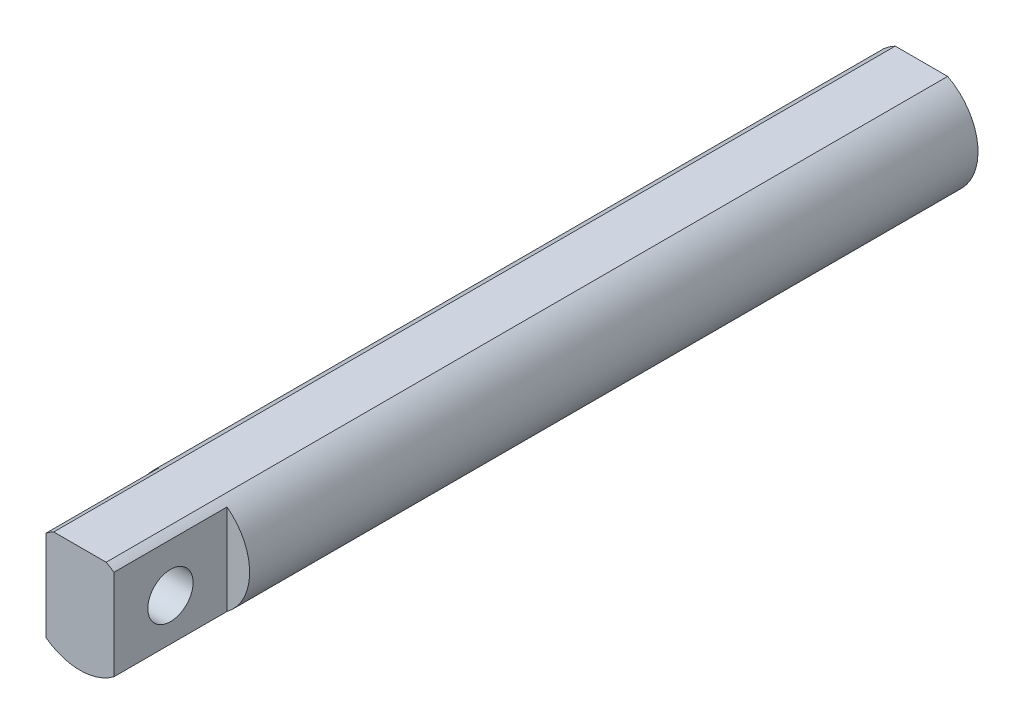
ISO-10303-21;
HEADER;
FILE_DESCRIPTION(('STEP AP214'),'2;1');
FILE_NAME('part.step','',(''),(''),'','','');
FILE_SCHEMA(('AUTOMOTIVE_DESIGN { 1 0 10303 214 1 1 1 1 }'));
ENDSEC;
DATA;
#1=APPLICATION_CONTEXT('core data for automotive mechanical design processes');
#2=APPLICATION_PROTOCOL_DEFINITION('international standard','automotive_design',2000,#1);
#3=PRODUCT_CONTEXT('',#1,'mechanical');
#4=PRODUCT('Part','Part','',(#3));
#5=PRODUCT_RELATED_PRODUCT_CATEGORY('part','',(#4));
#6=PRODUCT_DEFINITION_FORMATION('','',#4);
#7=PRODUCT_DEFINITION_CONTEXT('part definition',#1,'design');
#8=PRODUCT_DEFINITION('design','',#6,#7);
#9=PRODUCT_DEFINITION_SHAPE('','',#8);
#10=(LENGTH_UNIT() NAMED_UNIT(*) SI_UNIT(.MILLI.,.METRE.));
#11=(NAMED_UNIT(*) PLANE_ANGLE_UNIT() SI_UNIT($,.RADIAN.));
#12=(NAMED_UNIT(*) SI_UNIT($,.STERADIAN.) SOLID_ANGLE_UNIT());
#13=UNCERTAINTY_MEASURE_WITH_UNIT(LENGTH_MEASURE(1.E-05),#10,'distance_accuracy_value','');
#14=(GEOMETRIC_REPRESENTATION_CONTEXT(3) GLOBAL_UNCERTAINTY_ASSIGNED_CONTEXT((#13)) GLOBAL_UNIT_ASSIGNED_CONTEXT((#10,
#11,#12)) REPRESENTATION_CONTEXT('',''));
#15=CARTESIAN_POINT('',(0.,0.,0.));
#16=DIRECTION('',(0.,0.,1.));
#17=DIRECTION('',(1.,0.,0.));
#18=AXIS2_PLACEMENT_3D('',#15,#16,#17);
#19=CARTESIAN_POINT('',(0.,0.,148.75));
#20=DIRECTION('',(0.,0.,-1.));
#21=DIRECTION('',(-1.,0.,0.));
#22=AXIS2_PLACEMENT_3D('',#19,#20,#21);
#23=CYLINDRICAL_SURFACE('',#22,10.);
#24=CARTESIAN_POINT('',(0.,0.,148.75));
#25=DIRECTION('',(0.,0.,1.));
#26=DIRECTION('',(1.,0.,0.));
#27=AXIS2_PLACEMENT_3D('',#24,#25,#26);
#28=CIRCLE('',#27,10.);
#29=CARTESIAN_POINT('',(-4.6342500643059,8.86136142708787,148.75));
#30=VERTEX_POINT('',#29);
#31=CARTESIAN_POINT('',(-6.,8.,148.75));
#32=VERTEX_POINT('',#31);
#33=EDGE_CURVE('E97',#30,#32,#28,.T.);
#34=ORIENTED_EDGE('',*,*,#33,.F.);
#35=DIRECTION('',(0.,0.,-1.));
#36=VECTOR('',#35,1.);
#37=CARTESIAN_POINT('',(-4.6342500643059,8.86136142708787,148.75));
#38=LINE('',#37,#36);
#39=CARTESIAN_POINT('',(-4.6342500643059,8.86136142708787,0.));
#40=VERTEX_POINT('',#39);
#41=EDGE_CURVE('E83',#30,#40,#38,.T.);
#42=ORIENTED_EDGE('',*,*,#41,.T.);
#43=CARTESIAN_POINT('',(0.,0.,0.));
#44=DIRECTION('',(0.,0.,1.));
#45=DIRECTION('',(1.,0.,0.));
#46=AXIS2_PLACEMENT_3D('',#43,#44,#45);
#47=CIRCLE('',#46,10.);
#48=CARTESIAN_POINT('',(4.6342500643059,8.86136142708787,0.));
#49=VERTEX_POINT('',#48);
#50=EDGE_CURVE('E105',#40,#49,#47,.T.);
#51=ORIENTED_EDGE('',*,*,#50,.T.);
#52=DIRECTION('',(0.,0.,-1.));
#53=VECTOR('',#52,1.);
#54=CARTESIAN_POINT('',(4.6342500643059,8.86136142708787,148.75));
#55=LINE('',#54,#53);
#56=CARTESIAN_POINT('',(4.6342500643059,8.86136142708787,148.75));
#57=VERTEX_POINT('',#56);
#58=EDGE_CURVE('E47',#49,#57,#55,.F.);
#59=ORIENTED_EDGE('',*,*,#58,.T.);
#60=CARTESIAN_POINT('',(6.,8.,148.75));
#61=VERTEX_POINT('',#60);
#62=EDGE_CURVE('E100',#61,#57,#28,.T.);
#63=ORIENTED_EDGE('',*,*,#62,.F.);
#64=DIRECTION('',(0.,0.,-1.));
#65=VECTOR('',#64,1.);
#66=CARTESIAN_POINT('',(6.,8.,148.75));
#67=LINE('',#66,#65);
#68=CARTESIAN_POINT('',(6.,8.,128.75));
#69=VERTEX_POINT('',#68);
#70=EDGE_CURVE('E54',#61,#69,#67,.T.);
#71=ORIENTED_EDGE('',*,*,#70,.T.);
#72=CARTESIAN_POINT('',(0.,0.,128.75));
#73=DIRECTION('',(0.,0.,1.));
#74=DIRECTION('',(1.,0.,0.));
#75=AXIS2_PLACEMENT_3D('',#72,#73,#74);
#76=CIRCLE('',#75,10.);
#77=CARTESIAN_POINT('',(6.,-8.,128.75));
#78=VERTEX_POINT('',#77);
#79=EDGE_CURVE('E40',#78,#69,#76,.T.);
#80=ORIENTED_EDGE('',*,*,#79,.F.);
#81=DIRECTION('',(0.,0.,-1.));
#82=VECTOR('',#81,1.);
#83=CARTESIAN_POINT('',(6.,-8.,148.75));
#84=LINE('',#83,#82);
#85=CARTESIAN_POINT('',(6.,-8.,148.75));
#86=VERTEX_POINT('',#85);
#87=EDGE_CURVE('E127',#78,#86,#84,.F.);
#88=ORIENTED_EDGE('',*,*,#87,.T.);
#89=CARTESIAN_POINT('',(-6.,-8.,148.75));
#90=VERTEX_POINT('',#89);
#91=EDGE_CURVE('E107',#90,#86,#28,.T.);
#92=ORIENTED_EDGE('',*,*,#91,.F.);
#93=DIRECTION('',(0.,0.,-1.));
#94=VECTOR('',#93,1.);
#95=CARTESIAN_POINT('',(-6.,-8.,148.75));
#96=LINE('',#95,#94);
#97=CARTESIAN_POINT('',(-6.,-8.,128.75));
#98=VERTEX_POINT('',#97);
#99=EDGE_CURVE('E108',#90,#98,#96,.T.);
#100=ORIENTED_EDGE('',*,*,#99,.T.);
#101=CARTESIAN_POINT('',(0.,0.,128.75));
#102=DIRECTION('',(0.,0.,-1.));
#103=DIRECTION('',(-1.,0.,0.));
#104=AXIS2_PLACEMENT_3D('',#101,#102,#103);
#105=CIRCLE('',#104,10.);
#106=CARTESIAN_POINT('',(-6.,8.,128.75));
#107=VERTEX_POINT('',#106);
#108=EDGE_CURVE('E114',#98,#107,#105,.T.);
#109=ORIENTED_EDGE('',*,*,#108,.T.);
#110=DIRECTION('',(0.,0.,-1.));
#111=VECTOR('',#110,1.);
#112=CARTESIAN_POINT('',(-6.,8.,148.75));
#113=LINE('',#112,#111);
#114=EDGE_CURVE('E104',#107,#32,#113,.F.);
#115=ORIENTED_EDGE('',*,*,#114,.T.);
#116=EDGE_LOOP('',(#34,#42,#51,#59,#63,#71,#80,#88,#92,#100,#109,#115));
#117=FACE_BOUND('',#116,.T.);
#118=ADVANCED_FACE('F32',(#117),#23,.T.);
#119=CARTESIAN_POINT('',(0.,0.,148.75));
#120=DIRECTION('',(0.,0.,1.));
#121=DIRECTION('',(1.,0.,0.));
#122=AXIS2_PLACEMENT_3D('',#119,#120,#121);
#123=PLANE('',#122);
#124=DIRECTION('',(1.,0.,0.));
#125=VECTOR('',#124,1.);
#126=CARTESIAN_POINT('',(-5.47698423918612,8.86136142708787,148.75));
#127=LINE('',#126,#125);
#128=EDGE_CURVE('E86',#30,#57,#127,.T.);
#129=ORIENTED_EDGE('',*,*,#128,.F.);
#130=ORIENTED_EDGE('',*,*,#33,.T.);
#131=DIRECTION('',(0.,1.,0.));
#132=VECTOR('',#131,1.);
#133=CARTESIAN_POINT('',(-6.,0.,148.75));
#134=LINE('',#133,#132);
#135=EDGE_CURVE('E112',#90,#32,#134,.T.);
#136=ORIENTED_EDGE('',*,*,#135,.F.);
#137=ORIENTED_EDGE('',*,*,#91,.T.);
#138=DIRECTION('',(0.,-1.,0.));
#139=VECTOR('',#138,1.);
#140=CARTESIAN_POINT('',(6.,0.,148.75));
#141=LINE('',#140,#139);
#142=EDGE_CURVE('E117',#61,#86,#141,.T.);
#143=ORIENTED_EDGE('',*,*,#142,.F.);
#144=ORIENTED_EDGE('',*,*,#62,.T.);
#145=EDGE_LOOP('',(#129,#130,#136,#137,#143,#144));
#146=FACE_BOUND('',#145,.T.);
#147=ADVANCED_FACE('F95',(#146),#123,.T.);
#148=CARTESIAN_POINT('',(0.,0.,0.));
#149=DIRECTION('',(0.,0.,1.));
#150=DIRECTION('',(1.,0.,0.));
#151=AXIS2_PLACEMENT_3D('',#148,#149,#150);
#152=PLANE('',#151);
#153=ORIENTED_EDGE('',*,*,#50,.F.);
#154=DIRECTION('',(1.,0.,0.));
#155=VECTOR('',#154,1.);
#156=CARTESIAN_POINT('',(0.,8.86136142708787,0.));
#157=LINE('',#156,#155);
#158=EDGE_CURVE('E11',#40,#49,#157,.T.);
#159=ORIENTED_EDGE('',*,*,#158,.T.);
#160=EDGE_LOOP('',(#153,#159));
#161=FACE_BOUND('',#160,.T.);
#162=ADVANCED_FACE('F141',(#161),#152,.F.);
#163=CARTESIAN_POINT('',(0.,0.,128.75));
#164=DIRECTION('',(0.,0.,-1.));
#165=DIRECTION('',(-1.,0.,0.));
#166=AXIS2_PLACEMENT_3D('',#163,#164,#165);
#167=PLANE('',#166);
#168=DIRECTION('',(0.,1.,0.));
#169=VECTOR('',#168,1.);
#170=CARTESIAN_POINT('',(-6.,11.7941802520899,128.75));
#171=LINE('',#170,#169);
#172=EDGE_CURVE('E129',#98,#107,#171,.T.);
#173=ORIENTED_EDGE('',*,*,#172,.T.);
#174=ORIENTED_EDGE('',*,*,#108,.F.);
#175=EDGE_LOOP('',(#173,#174));
#176=FACE_BOUND('',#175,.T.);
#177=ADVANCED_FACE('F139',(#176),#167,.F.);
#178=CARTESIAN_POINT('',(-6.,11.7941802520899,128.75));
#179=DIRECTION('',(1.,0.,0.));
#180=DIRECTION('',(0.,1.,0.));
#181=AXIS2_PLACEMENT_3D('',#178,#179,#180);
#182=PLANE('',#181);
#183=CARTESIAN_POINT('',(-6.,-0.552617742165498,138.75));
#184=DIRECTION('',(-1.,0.,0.));
#185=DIRECTION('',(0.,-1.,0.));
#186=AXIS2_PLACEMENT_3D('',#183,#184,#185);
#187=CIRCLE('',#186,3.99999999999999);
#188=CARTESIAN_POINT('',(-6.,-4.55261774216549,138.75));
#189=VERTEX_POINT('',#188);
#190=EDGE_CURVE('E219',#189,#189,#187,.T.);
#191=ORIENTED_EDGE('',*,*,#190,.F.);
#192=EDGE_LOOP('',(#191));
#193=FACE_BOUND('',#192,.T.);
#194=ORIENTED_EDGE('',*,*,#135,.T.);
#195=ORIENTED_EDGE('',*,*,#114,.F.);
#196=ORIENTED_EDGE('',*,*,#172,.F.);
#197=ORIENTED_EDGE('',*,*,#99,.F.);
#198=EDGE_LOOP('',(#194,#195,#196,#197));
#199=FACE_BOUND('',#198,.T.);
#200=ADVANCED_FACE('F137',(#193,#199),#182,.F.);
#201=CARTESIAN_POINT('',(0.,0.,128.75));
#202=DIRECTION('',(0.,0.,1.));
#203=DIRECTION('',(1.,0.,0.));
#204=AXIS2_PLACEMENT_3D('',#201,#202,#203);
#205=PLANE('',#204);
#206=ORIENTED_EDGE('',*,*,#79,.T.);
#207=DIRECTION('',(0.,-1.,0.));
#208=VECTOR('',#207,1.);
#209=CARTESIAN_POINT('',(6.,12.1693430434089,128.75));
#210=LINE('',#209,#208);
#211=EDGE_CURVE('E91',#69,#78,#210,.T.);
#212=ORIENTED_EDGE('',*,*,#211,.T.);
#213=EDGE_LOOP('',(#206,#212));
#214=FACE_BOUND('',#213,.T.);
#215=ADVANCED_FACE('F124',(#214),#205,.T.);
#216=CARTESIAN_POINT('',(6.,12.1693430434089,128.75));
#217=DIRECTION('',(-1.,0.,0.));
#218=DIRECTION('',(0.,-1.,0.));
#219=AXIS2_PLACEMENT_3D('',#216,#217,#218);
#220=PLANE('',#219);
#221=CARTESIAN_POINT('',(6.,-0.552617742165497,138.75));
#222=DIRECTION('',(-1.,0.,0.));
#223=DIRECTION('',(0.,-1.,0.));
#224=AXIS2_PLACEMENT_3D('',#221,#222,#223);
#225=CIRCLE('',#224,3.99999999999999);
#226=CARTESIAN_POINT('',(6.,-4.55261774216549,138.75));
#227=VERTEX_POINT('',#226);
#228=EDGE_CURVE('E35',#227,#227,#225,.T.);
#229=ORIENTED_EDGE('',*,*,#228,.T.);
#230=EDGE_LOOP('',(#229));
#231=FACE_BOUND('',#230,.T.);
#232=ORIENTED_EDGE('',*,*,#142,.T.);
#233=ORIENTED_EDGE('',*,*,#87,.F.);
#234=ORIENTED_EDGE('',*,*,#211,.F.);
#235=ORIENTED_EDGE('',*,*,#70,.F.);
#236=EDGE_LOOP('',(#232,#233,#234,#235));
#237=FACE_BOUND('',#236,.T.);
#238=ADVANCED_FACE('F126',(#231,#237),#220,.F.);
#239=CARTESIAN_POINT('',(-5.47698423918612,8.86136142708787,-71.25));
#240=DIRECTION('',(0.,-1.,0.));
#241=DIRECTION('',(0.,0.,-1.));
#242=AXIS2_PLACEMENT_3D('',#239,#240,#241);
#243=PLANE('',#242);
#244=ORIENTED_EDGE('',*,*,#128,.T.);
#245=ORIENTED_EDGE('',*,*,#58,.F.);
#246=ORIENTED_EDGE('',*,*,#158,.F.);
#247=ORIENTED_EDGE('',*,*,#41,.F.);
#248=EDGE_LOOP('',(#244,#245,#246,#247));
#249=FACE_BOUND('',#248,.T.);
#250=ADVANCED_FACE('F85',(#249),#243,.F.);
#251=CARTESIAN_POINT('',(10.,-0.552617742165497,138.75));
#252=DIRECTION('',(-1.,0.,0.));
#253=DIRECTION('',(0.,-1.,0.));
#254=AXIS2_PLACEMENT_3D('',#251,#252,#253);
#255=CYLINDRICAL_SURFACE('',#254,3.99999999999999);
#256=ORIENTED_EDGE('',*,*,#190,.T.);
#257=EDGE_LOOP('',(#256));
#258=FACE_BOUND('',#257,.T.);
#259=ORIENTED_EDGE('',*,*,#228,.F.);
#260=EDGE_LOOP('',(#259));
#261=FACE_BOUND('',#260,.T.);
#262=ADVANCED_FACE('F172',(#258,#261),#255,.F.);
#263=CLOSED_SHELL('',(#118,#147,#162,#177,#200,#215,#238,#250,#262));
#264=MANIFOLD_SOLID_BREP('B2',#263);
#265=ADVANCED_BREP_SHAPE_REPRESENTATION('',(#18,#264),#14);
#266=SHAPE_DEFINITION_REPRESENTATION(#9,#265);
ENDSEC;
END-ISO-10303-21;
